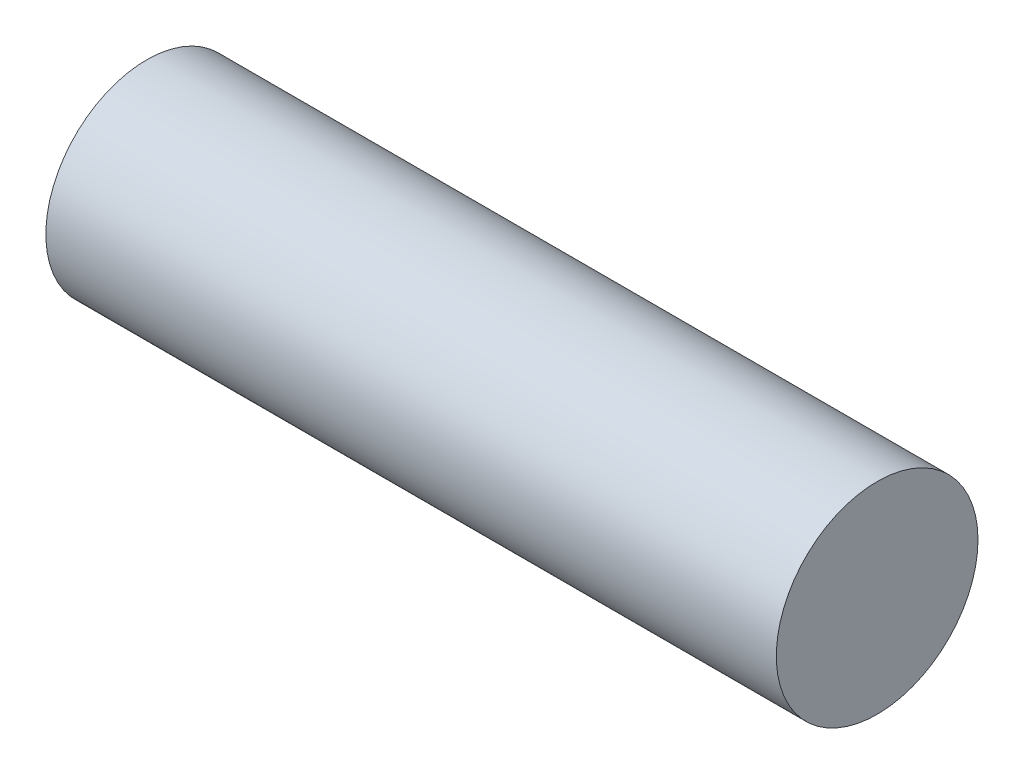
ISO-10303-21;
HEADER;
FILE_DESCRIPTION(('STEP AP214'),'2;1');
FILE_NAME('part.step','',(''),(''),'','','');
FILE_SCHEMA(('AUTOMOTIVE_DESIGN { 1 0 10303 214 1 1 1 1 }'));
ENDSEC;
DATA;
#1=APPLICATION_CONTEXT('core data for automotive mechanical design processes');
#2=APPLICATION_PROTOCOL_DEFINITION('international standard','automotive_design',2000,#1);
#3=PRODUCT_CONTEXT('',#1,'mechanical');
#4=PRODUCT('Part','Part','',(#3));
#5=PRODUCT_RELATED_PRODUCT_CATEGORY('part','',(#4));
#6=PRODUCT_DEFINITION_FORMATION('','',#4);
#7=PRODUCT_DEFINITION_CONTEXT('part definition',#1,'design');
#8=PRODUCT_DEFINITION('design','',#6,#7);
#9=PRODUCT_DEFINITION_SHAPE('','',#8);
#10=(LENGTH_UNIT() NAMED_UNIT(*) SI_UNIT(.MILLI.,.METRE.));
#11=(NAMED_UNIT(*) PLANE_ANGLE_UNIT() SI_UNIT($,.RADIAN.));
#12=(NAMED_UNIT(*) SI_UNIT($,.STERADIAN.) SOLID_ANGLE_UNIT());
#13=UNCERTAINTY_MEASURE_WITH_UNIT(LENGTH_MEASURE(1.E-05),#10,'distance_accuracy_value','');
#14=(GEOMETRIC_REPRESENTATION_CONTEXT(3) GLOBAL_UNCERTAINTY_ASSIGNED_CONTEXT((#13)) GLOBAL_UNIT_ASSIGNED_CONTEXT((#10,
#11,#12)) REPRESENTATION_CONTEXT('',''));
#15=CARTESIAN_POINT('',(0.,0.,0.));
#16=DIRECTION('',(0.,0.,1.));
#17=DIRECTION('',(1.,0.,0.));
#18=AXIS2_PLACEMENT_3D('',#15,#16,#17);
#19=CARTESIAN_POINT('',(-67.,0.,0.));
#20=DIRECTION('',(1.,0.,0.));
#21=DIRECTION('',(0.,0.,-1.));
#22=AXIS2_PLACEMENT_3D('',#19,#20,#21);
#23=CYLINDRICAL_SURFACE('',#22,9.25);
#24=CARTESIAN_POINT('',(-67.,0.,0.));
#25=DIRECTION('',(1.,0.,0.));
#26=DIRECTION('',(0.,0.,-1.));
#27=AXIS2_PLACEMENT_3D('',#24,#25,#26);
#28=CIRCLE('',#27,9.25);
#29=CARTESIAN_POINT('',(-67.,0.,-9.25));
#30=VERTEX_POINT('',#29);
#31=EDGE_CURVE('E10',#30,#30,#28,.T.);
#32=ORIENTED_EDGE('',*,*,#31,.T.);
#33=EDGE_LOOP('',(#32));
#34=FACE_BOUND('',#33,.T.);
#35=CARTESIAN_POINT('',(0.,0.,0.));
#36=DIRECTION('',(1.,0.,0.));
#37=DIRECTION('',(0.,0.,-1.));
#38=AXIS2_PLACEMENT_3D('',#35,#36,#37);
#39=CIRCLE('',#38,9.25);
#40=CARTESIAN_POINT('',(0.,0.,-9.25));
#41=VERTEX_POINT('',#40);
#42=EDGE_CURVE('E37',#41,#41,#39,.T.);
#43=ORIENTED_EDGE('',*,*,#42,.F.);
#44=EDGE_LOOP('',(#43));
#45=FACE_BOUND('',#44,.T.);
#46=ADVANCED_FACE('F34',(#34,#45),#23,.T.);
#47=CARTESIAN_POINT('',(-67.,0.,0.));
#48=DIRECTION('',(1.,0.,0.));
#49=DIRECTION('',(0.,0.,-1.));
#50=AXIS2_PLACEMENT_3D('',#47,#48,#49);
#51=PLANE('',#50);
#52=ORIENTED_EDGE('',*,*,#31,.F.);
#53=EDGE_LOOP('',(#52));
#54=FACE_BOUND('',#53,.T.);
#55=ADVANCED_FACE('F49',(#54),#51,.F.);
#56=CARTESIAN_POINT('',(0.,0.,0.));
#57=DIRECTION('',(1.,0.,0.));
#58=DIRECTION('',(0.,0.,-1.));
#59=AXIS2_PLACEMENT_3D('',#56,#57,#58);
#60=PLANE('',#59);
#61=ORIENTED_EDGE('',*,*,#42,.T.);
#62=EDGE_LOOP('',(#61));
#63=FACE_BOUND('',#62,.T.);
#64=ADVANCED_FACE('F46',(#63),#60,.T.);
#65=CLOSED_SHELL('',(#46,#55,#64));
#66=MANIFOLD_SOLID_BREP('B2',#65);
#67=ADVANCED_BREP_SHAPE_REPRESENTATION('',(#18,#66),#14);
#68=SHAPE_DEFINITION_REPRESENTATION(#9,#67);
ENDSEC;
END-ISO-10303-21;
